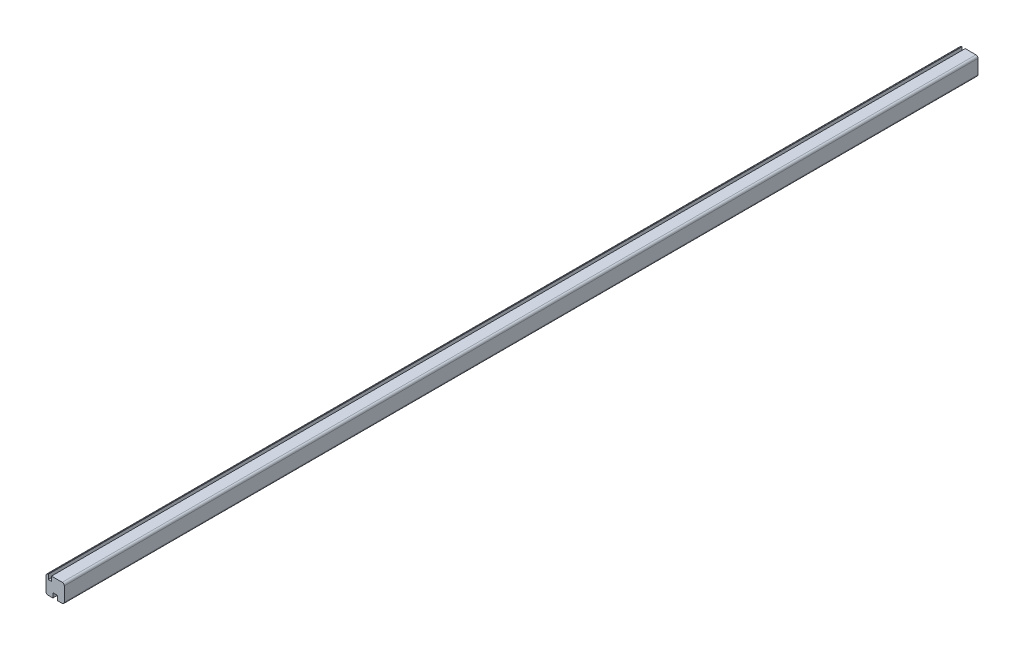
ISO-10303-21;
HEADER;
FILE_DESCRIPTION(('STEP AP214'),'2;1');
FILE_NAME('part.step','',(''),(''),'','','');
FILE_SCHEMA(('AUTOMOTIVE_DESIGN { 1 0 10303 214 1 1 1 1 }'));
ENDSEC;
DATA;
#1=APPLICATION_CONTEXT('core data for automotive mechanical design processes');
#2=APPLICATION_PROTOCOL_DEFINITION('international standard','automotive_design',2000,#1);
#3=PRODUCT_CONTEXT('',#1,'mechanical');
#4=PRODUCT('Part','Part','',(#3));
#5=PRODUCT_RELATED_PRODUCT_CATEGORY('part','',(#4));
#6=PRODUCT_DEFINITION_FORMATION('','',#4);
#7=PRODUCT_DEFINITION_CONTEXT('part definition',#1,'design');
#8=PRODUCT_DEFINITION('design','',#6,#7);
#9=PRODUCT_DEFINITION_SHAPE('','',#8);
#10=(LENGTH_UNIT() NAMED_UNIT(*) SI_UNIT(.MILLI.,.METRE.));
#11=(NAMED_UNIT(*) PLANE_ANGLE_UNIT() SI_UNIT($,.RADIAN.));
#12=(NAMED_UNIT(*) SI_UNIT($,.STERADIAN.) SOLID_ANGLE_UNIT());
#13=UNCERTAINTY_MEASURE_WITH_UNIT(LENGTH_MEASURE(1.E-05),#10,'distance_accuracy_value','');
#14=(GEOMETRIC_REPRESENTATION_CONTEXT(3) GLOBAL_UNCERTAINTY_ASSIGNED_CONTEXT((#13)) GLOBAL_UNIT_ASSIGNED_CONTEXT((#10,
#11,#12)) REPRESENTATION_CONTEXT('',''));
#15=CARTESIAN_POINT('',(0.,0.,0.));
#16=DIRECTION('',(0.,0.,1.));
#17=DIRECTION('',(1.,0.,0.));
#18=AXIS2_PLACEMENT_3D('',#15,#16,#17);
#19=CARTESIAN_POINT('',(-5.,-20.,2000.));
#20=DIRECTION('',(-1.,0.,0.));
#21=DIRECTION('',(0.,-1.,0.));
#22=AXIS2_PLACEMENT_3D('',#19,#20,#21);
#23=PLANE('',#22);
#24=DIRECTION('',(0.,1.,0.));
#25=VECTOR('',#24,1.);
#26=CARTESIAN_POINT('',(-5.,-20.,0.));
#27=LINE('',#26,#25);
#28=CARTESIAN_POINT('',(-5.,-20.,0.));
#29=VERTEX_POINT('',#28);
#30=CARTESIAN_POINT('',(-5.,-10.,0.));
#31=VERTEX_POINT('',#30);
#32=EDGE_CURVE('E178',#29,#31,#27,.T.);
#33=ORIENTED_EDGE('',*,*,#32,.T.);
#34=DIRECTION('',(0.,0.,-1.));
#35=VECTOR('',#34,1.);
#36=CARTESIAN_POINT('',(-5.,-10.,2000.));
#37=LINE('',#36,#35);
#38=CARTESIAN_POINT('',(-5.,-10.,2000.));
#39=VERTEX_POINT('',#38);
#40=EDGE_CURVE('E11',#39,#31,#37,.T.);
#41=ORIENTED_EDGE('',*,*,#40,.F.);
#42=DIRECTION('',(0.,1.,0.));
#43=VECTOR('',#42,1.);
#44=CARTESIAN_POINT('',(-5.,-20.,2000.));
#45=LINE('',#44,#43);
#46=CARTESIAN_POINT('',(-5.,-20.,2000.));
#47=VERTEX_POINT('',#46);
#48=EDGE_CURVE('E208',#47,#39,#45,.T.);
#49=ORIENTED_EDGE('',*,*,#48,.F.);
#50=DIRECTION('',(0.,0.,-1.));
#51=VECTOR('',#50,1.);
#52=CARTESIAN_POINT('',(-5.,-20.,2000.));
#53=LINE('',#52,#51);
#54=EDGE_CURVE('E174',#47,#29,#53,.T.);
#55=ORIENTED_EDGE('',*,*,#54,.T.);
#56=EDGE_LOOP('',(#33,#41,#49,#55));
#57=FACE_BOUND('',#56,.T.);
#58=ADVANCED_FACE('F34',(#57),#23,.F.);
#59=CARTESIAN_POINT('',(-5.,-10.,2000.));
#60=DIRECTION('',(0.,1.,0.));
#61=DIRECTION('',(-1.,0.,0.));
#62=AXIS2_PLACEMENT_3D('',#59,#60,#61);
#63=PLANE('',#62);
#64=DIRECTION('',(1.,0.,0.));
#65=VECTOR('',#64,1.);
#66=CARTESIAN_POINT('',(-5.,-10.,0.));
#67=LINE('',#66,#65);
#68=CARTESIAN_POINT('',(5.,-10.,0.));
#69=VERTEX_POINT('',#68);
#70=EDGE_CURVE('E181',#31,#69,#67,.T.);
#71=ORIENTED_EDGE('',*,*,#70,.T.);
#72=DIRECTION('',(0.,0.,-1.));
#73=VECTOR('',#72,1.);
#74=CARTESIAN_POINT('',(5.,-10.,2000.));
#75=LINE('',#74,#73);
#76=CARTESIAN_POINT('',(5.,-10.,2000.));
#77=VERTEX_POINT('',#76);
#78=EDGE_CURVE('E42',#77,#69,#75,.T.);
#79=ORIENTED_EDGE('',*,*,#78,.F.);
#80=DIRECTION('',(1.,0.,0.));
#81=VECTOR('',#80,1.);
#82=CARTESIAN_POINT('',(-5.,-10.,2000.));
#83=LINE('',#82,#81);
#84=EDGE_CURVE('E117',#39,#77,#83,.T.);
#85=ORIENTED_EDGE('',*,*,#84,.F.);
#86=ORIENTED_EDGE('',*,*,#40,.T.);
#87=EDGE_LOOP('',(#71,#79,#85,#86));
#88=FACE_BOUND('',#87,.T.);
#89=ADVANCED_FACE('F306',(#88),#63,.F.);
#90=CARTESIAN_POINT('',(5.,-20.,2000.));
#91=DIRECTION('',(1.,0.,0.));
#92=DIRECTION('',(0.,0.,-1.));
#93=AXIS2_PLACEMENT_3D('',#90,#91,#92);
#94=PLANE('',#93);
#95=DIRECTION('',(0.,-1.,0.));
#96=VECTOR('',#95,1.);
#97=CARTESIAN_POINT('',(5.,-20.,0.));
#98=LINE('',#97,#96);
#99=CARTESIAN_POINT('',(5.,-20.,0.));
#100=VERTEX_POINT('',#99);
#101=EDGE_CURVE('E183',#69,#100,#98,.T.);
#102=ORIENTED_EDGE('',*,*,#101,.T.);
#103=DIRECTION('',(0.,0.,-1.));
#104=VECTOR('',#103,1.);
#105=CARTESIAN_POINT('',(5.,-20.,2000.));
#106=LINE('',#105,#104);
#107=CARTESIAN_POINT('',(5.,-20.,2000.));
#108=VERTEX_POINT('',#107);
#109=EDGE_CURVE('E239',#108,#100,#106,.T.);
#110=ORIENTED_EDGE('',*,*,#109,.F.);
#111=DIRECTION('',(0.,-1.,0.));
#112=VECTOR('',#111,1.);
#113=CARTESIAN_POINT('',(5.,-20.,2000.));
#114=LINE('',#113,#112);
#115=EDGE_CURVE('E247',#77,#108,#114,.T.);
#116=ORIENTED_EDGE('',*,*,#115,.F.);
#117=ORIENTED_EDGE('',*,*,#78,.T.);
#118=EDGE_LOOP('',(#102,#110,#116,#117));
#119=FACE_BOUND('',#118,.T.);
#120=ADVANCED_FACE('F245',(#119),#94,.F.);
#121=CARTESIAN_POINT('',(5.,-20.,2000.));
#122=DIRECTION('',(0.,1.,0.));
#123=DIRECTION('',(0.,0.,1.));
#124=AXIS2_PLACEMENT_3D('',#121,#122,#123);
#125=PLANE('',#124);
#126=DIRECTION('',(1.,0.,0.));
#127=VECTOR('',#126,1.);
#128=CARTESIAN_POINT('',(5.,-20.,0.));
#129=LINE('',#128,#127);
#130=CARTESIAN_POINT('',(15.5,-20.,0.));
#131=VERTEX_POINT('',#130);
#132=EDGE_CURVE('E185',#100,#131,#129,.T.);
#133=ORIENTED_EDGE('',*,*,#132,.T.);
#134=DIRECTION('',(0.,0.,-1.));
#135=VECTOR('',#134,1.);
#136=CARTESIAN_POINT('',(15.5,-20.,2000.));
#137=LINE('',#136,#135);
#138=CARTESIAN_POINT('',(15.5,-20.,2000.));
#139=VERTEX_POINT('',#138);
#140=EDGE_CURVE('E236',#139,#131,#137,.T.);
#141=ORIENTED_EDGE('',*,*,#140,.F.);
#142=DIRECTION('',(1.,0.,0.));
#143=VECTOR('',#142,1.);
#144=CARTESIAN_POINT('',(5.,-20.,2000.));
#145=LINE('',#144,#143);
#146=EDGE_CURVE('E265',#108,#139,#145,.T.);
#147=ORIENTED_EDGE('',*,*,#146,.F.);
#148=ORIENTED_EDGE('',*,*,#109,.T.);
#149=EDGE_LOOP('',(#133,#141,#147,#148));
#150=FACE_BOUND('',#149,.T.);
#151=ADVANCED_FACE('F256',(#150),#125,.F.);
#152=CARTESIAN_POINT('',(15.5,-15.5,2000.));
#153=DIRECTION('',(0.,0.,-1.));
#154=DIRECTION('',(-1.,0.,0.));
#155=AXIS2_PLACEMENT_3D('',#152,#153,#154);
#156=CYLINDRICAL_SURFACE('',#155,4.5);
#157=CARTESIAN_POINT('',(15.5,-15.5,0.));
#158=DIRECTION('',(0.,0.,1.));
#159=DIRECTION('',(1.,0.,0.));
#160=AXIS2_PLACEMENT_3D('',#157,#158,#159);
#161=CIRCLE('',#160,4.5);
#162=CARTESIAN_POINT('',(20.,-15.5,0.));
#163=VERTEX_POINT('',#162);
#164=EDGE_CURVE('E187',#131,#163,#161,.T.);
#165=ORIENTED_EDGE('',*,*,#164,.T.);
#166=DIRECTION('',(0.,0.,-1.));
#167=VECTOR('',#166,1.);
#168=CARTESIAN_POINT('',(20.,-15.5,2000.));
#169=LINE('',#168,#167);
#170=CARTESIAN_POINT('',(20.,-15.5,2000.));
#171=VERTEX_POINT('',#170);
#172=EDGE_CURVE('E233',#171,#163,#169,.T.);
#173=ORIENTED_EDGE('',*,*,#172,.F.);
#174=CARTESIAN_POINT('',(15.5,-15.5,2000.));
#175=DIRECTION('',(0.,0.,1.));
#176=DIRECTION('',(1.,0.,0.));
#177=AXIS2_PLACEMENT_3D('',#174,#175,#176);
#178=CIRCLE('',#177,4.5);
#179=EDGE_CURVE('E262',#139,#171,#178,.T.);
#180=ORIENTED_EDGE('',*,*,#179,.F.);
#181=ORIENTED_EDGE('',*,*,#140,.T.);
#182=EDGE_LOOP('',(#165,#173,#180,#181));
#183=FACE_BOUND('',#182,.T.);
#184=ADVANCED_FACE('F260',(#183),#156,.T.);
#185=CARTESIAN_POINT('',(20.,-15.5,2000.));
#186=DIRECTION('',(-1.,0.,0.));
#187=DIRECTION('',(0.,0.,1.));
#188=AXIS2_PLACEMENT_3D('',#185,#186,#187);
#189=PLANE('',#188);
#190=DIRECTION('',(0.,1.,0.));
#191=VECTOR('',#190,1.);
#192=CARTESIAN_POINT('',(20.,-15.5,0.));
#193=LINE('',#192,#191);
#194=CARTESIAN_POINT('',(20.,15.5,0.));
#195=VERTEX_POINT('',#194);
#196=EDGE_CURVE('E189',#163,#195,#193,.T.);
#197=ORIENTED_EDGE('',*,*,#196,.T.);
#198=DIRECTION('',(0.,0.,-1.));
#199=VECTOR('',#198,1.);
#200=CARTESIAN_POINT('',(20.,15.5,2000.));
#201=LINE('',#200,#199);
#202=CARTESIAN_POINT('',(20.,15.5,2000.));
#203=VERTEX_POINT('',#202);
#204=EDGE_CURVE('E230',#203,#195,#201,.T.);
#205=ORIENTED_EDGE('',*,*,#204,.F.);
#206=DIRECTION('',(0.,1.,0.));
#207=VECTOR('',#206,1.);
#208=CARTESIAN_POINT('',(20.,-15.5,2000.));
#209=LINE('',#208,#207);
#210=EDGE_CURVE('E264',#171,#203,#209,.T.);
#211=ORIENTED_EDGE('',*,*,#210,.F.);
#212=ORIENTED_EDGE('',*,*,#172,.T.);
#213=EDGE_LOOP('',(#197,#205,#211,#212));
#214=FACE_BOUND('',#213,.T.);
#215=ADVANCED_FACE('F319',(#214),#189,.F.);
#216=CARTESIAN_POINT('',(15.5,15.5,2000.));
#217=DIRECTION('',(0.,0.,-1.));
#218=DIRECTION('',(-1.,0.,0.));
#219=AXIS2_PLACEMENT_3D('',#216,#217,#218);
#220=CYLINDRICAL_SURFACE('',#219,4.5);
#221=CARTESIAN_POINT('',(15.5,15.5,0.));
#222=DIRECTION('',(0.,0.,1.));
#223=DIRECTION('',(-1.,0.,0.));
#224=AXIS2_PLACEMENT_3D('',#221,#222,#223);
#225=CIRCLE('',#224,4.5);
#226=CARTESIAN_POINT('',(15.5,20.,0.));
#227=VERTEX_POINT('',#226);
#228=EDGE_CURVE('E191',#195,#227,#225,.T.);
#229=ORIENTED_EDGE('',*,*,#228,.T.);
#230=DIRECTION('',(0.,0.,-1.));
#231=VECTOR('',#230,1.);
#232=CARTESIAN_POINT('',(15.5,20.,2000.));
#233=LINE('',#232,#231);
#234=CARTESIAN_POINT('',(15.5,20.,2000.));
#235=VERTEX_POINT('',#234);
#236=EDGE_CURVE('E227',#235,#227,#233,.T.);
#237=ORIENTED_EDGE('',*,*,#236,.F.);
#238=CARTESIAN_POINT('',(15.5,15.5,2000.));
#239=DIRECTION('',(0.,0.,1.));
#240=DIRECTION('',(-1.,0.,0.));
#241=AXIS2_PLACEMENT_3D('',#238,#239,#240);
#242=CIRCLE('',#241,4.5);
#243=EDGE_CURVE('E267',#203,#235,#242,.T.);
#244=ORIENTED_EDGE('',*,*,#243,.F.);
#245=ORIENTED_EDGE('',*,*,#204,.T.);
#246=EDGE_LOOP('',(#229,#237,#244,#245));
#247=FACE_BOUND('',#246,.T.);
#248=ADVANCED_FACE('F322',(#247),#220,.T.);
#249=CARTESIAN_POINT('',(-8.,20.,2000.));
#250=DIRECTION('',(0.,-1.,0.));
#251=DIRECTION('',(0.,0.,-1.));
#252=AXIS2_PLACEMENT_3D('',#249,#250,#251);
#253=PLANE('',#252);
#254=DIRECTION('',(-1.,0.,0.));
#255=VECTOR('',#254,1.);
#256=CARTESIAN_POINT('',(-8.,20.,0.));
#257=LINE('',#256,#255);
#258=CARTESIAN_POINT('',(-8.,20.,0.));
#259=VERTEX_POINT('',#258);
#260=EDGE_CURVE('E193',#227,#259,#257,.T.);
#261=ORIENTED_EDGE('',*,*,#260,.T.);
#262=DIRECTION('',(0.,0.,-1.));
#263=VECTOR('',#262,1.);
#264=CARTESIAN_POINT('',(-8.,20.,2000.));
#265=LINE('',#264,#263);
#266=CARTESIAN_POINT('',(-8.,20.,2000.));
#267=VERTEX_POINT('',#266);
#268=EDGE_CURVE('E224',#267,#259,#265,.T.);
#269=ORIENTED_EDGE('',*,*,#268,.F.);
#270=DIRECTION('',(-1.,0.,0.));
#271=VECTOR('',#270,1.);
#272=CARTESIAN_POINT('',(-8.,20.,2000.));
#273=LINE('',#272,#271);
#274=EDGE_CURVE('E273',#235,#267,#273,.T.);
#275=ORIENTED_EDGE('',*,*,#274,.F.);
#276=ORIENTED_EDGE('',*,*,#236,.T.);
#277=EDGE_LOOP('',(#261,#269,#275,#276));
#278=FACE_BOUND('',#277,.T.);
#279=ADVANCED_FACE('F326',(#278),#253,.F.);
#280=CARTESIAN_POINT('',(-8.,20.,2000.));
#281=DIRECTION('',(1.,0.,0.));
#282=DIRECTION('',(0.,1.,0.));
#283=AXIS2_PLACEMENT_3D('',#280,#281,#282);
#284=PLANE('',#283);
#285=DIRECTION('',(0.,-1.,0.));
#286=VECTOR('',#285,1.);
#287=CARTESIAN_POINT('',(-8.,20.,0.));
#288=LINE('',#287,#286);
#289=CARTESIAN_POINT('',(-8.,10.,0.));
#290=VERTEX_POINT('',#289);
#291=EDGE_CURVE('E195',#259,#290,#288,.T.);
#292=ORIENTED_EDGE('',*,*,#291,.T.);
#293=DIRECTION('',(0.,0.,-1.));
#294=VECTOR('',#293,1.);
#295=CARTESIAN_POINT('',(-8.,10.,2000.));
#296=LINE('',#295,#294);
#297=CARTESIAN_POINT('',(-8.,10.,2000.));
#298=VERTEX_POINT('',#297);
#299=EDGE_CURVE('E221',#298,#290,#296,.T.);
#300=ORIENTED_EDGE('',*,*,#299,.F.);
#301=DIRECTION('',(0.,-1.,0.));
#302=VECTOR('',#301,1.);
#303=CARTESIAN_POINT('',(-8.,20.,2000.));
#304=LINE('',#303,#302);
#305=EDGE_CURVE('E275',#267,#298,#304,.T.);
#306=ORIENTED_EDGE('',*,*,#305,.F.);
#307=ORIENTED_EDGE('',*,*,#268,.T.);
#308=EDGE_LOOP('',(#292,#300,#306,#307));
#309=FACE_BOUND('',#308,.T.);
#310=ADVANCED_FACE('F330',(#309),#284,.F.);
#311=CARTESIAN_POINT('',(-15.,10.,2000.));
#312=DIRECTION('',(0.,-1.,0.));
#313=DIRECTION('',(0.,0.,-1.));
#314=AXIS2_PLACEMENT_3D('',#311,#312,#313);
#315=PLANE('',#314);
#316=DIRECTION('',(-1.,0.,0.));
#317=VECTOR('',#316,1.);
#318=CARTESIAN_POINT('',(-15.,10.,0.));
#319=LINE('',#318,#317);
#320=CARTESIAN_POINT('',(-15.,10.,0.));
#321=VERTEX_POINT('',#320);
#322=EDGE_CURVE('E197',#290,#321,#319,.T.);
#323=ORIENTED_EDGE('',*,*,#322,.T.);
#324=DIRECTION('',(0.,0.,-1.));
#325=VECTOR('',#324,1.);
#326=CARTESIAN_POINT('',(-15.,10.,2000.));
#327=LINE('',#326,#325);
#328=CARTESIAN_POINT('',(-15.,10.,2000.));
#329=VERTEX_POINT('',#328);
#330=EDGE_CURVE('E218',#329,#321,#327,.T.);
#331=ORIENTED_EDGE('',*,*,#330,.F.);
#332=DIRECTION('',(-1.,0.,0.));
#333=VECTOR('',#332,1.);
#334=CARTESIAN_POINT('',(-15.,10.,2000.));
#335=LINE('',#334,#333);
#336=EDGE_CURVE('E277',#298,#329,#335,.T.);
#337=ORIENTED_EDGE('',*,*,#336,.F.);
#338=ORIENTED_EDGE('',*,*,#299,.T.);
#339=EDGE_LOOP('',(#323,#331,#337,#338));
#340=FACE_BOUND('',#339,.T.);
#341=ADVANCED_FACE('F334',(#340),#315,.F.);
#342=CARTESIAN_POINT('',(-15.,20.,2000.));
#343=DIRECTION('',(-1.,0.,0.));
#344=DIRECTION('',(0.,-1.,0.));
#345=AXIS2_PLACEMENT_3D('',#342,#343,#344);
#346=PLANE('',#345);
#347=DIRECTION('',(0.,1.,0.));
#348=VECTOR('',#347,1.);
#349=CARTESIAN_POINT('',(-15.,20.,0.));
#350=LINE('',#349,#348);
#351=CARTESIAN_POINT('',(-15.,20.,0.));
#352=VERTEX_POINT('',#351);
#353=EDGE_CURVE('E199',#321,#352,#350,.T.);
#354=ORIENTED_EDGE('',*,*,#353,.T.);
#355=DIRECTION('',(0.,0.,-1.));
#356=VECTOR('',#355,1.);
#357=CARTESIAN_POINT('',(-15.,20.,2000.));
#358=LINE('',#357,#356);
#359=CARTESIAN_POINT('',(-15.,20.,2000.));
#360=VERTEX_POINT('',#359);
#361=EDGE_CURVE('E215',#360,#352,#358,.T.);
#362=ORIENTED_EDGE('',*,*,#361,.F.);
#363=DIRECTION('',(0.,1.,0.));
#364=VECTOR('',#363,1.);
#365=CARTESIAN_POINT('',(-15.,20.,2000.));
#366=LINE('',#365,#364);
#367=EDGE_CURVE('E279',#329,#360,#366,.T.);
#368=ORIENTED_EDGE('',*,*,#367,.F.);
#369=ORIENTED_EDGE('',*,*,#330,.T.);
#370=EDGE_LOOP('',(#354,#362,#368,#369));
#371=FACE_BOUND('',#370,.T.);
#372=ADVANCED_FACE('F338',(#371),#346,.F.);
#373=CARTESIAN_POINT('',(-15.5,20.,2000.));
#374=DIRECTION('',(0.,-1.,0.));
#375=DIRECTION('',(0.,0.,-1.));
#376=AXIS2_PLACEMENT_3D('',#373,#374,#375);
#377=PLANE('',#376);
#378=DIRECTION('',(-1.,0.,0.));
#379=VECTOR('',#378,1.);
#380=CARTESIAN_POINT('',(-15.5,20.,0.));
#381=LINE('',#380,#379);
#382=CARTESIAN_POINT('',(-15.5,20.,0.));
#383=VERTEX_POINT('',#382);
#384=EDGE_CURVE('E201',#352,#383,#381,.T.);
#385=ORIENTED_EDGE('',*,*,#384,.T.);
#386=DIRECTION('',(0.,0.,-1.));
#387=VECTOR('',#386,1.);
#388=CARTESIAN_POINT('',(-15.5,20.,2000.));
#389=LINE('',#388,#387);
#390=CARTESIAN_POINT('',(-15.5,20.,2000.));
#391=VERTEX_POINT('',#390);
#392=EDGE_CURVE('E212',#391,#383,#389,.T.);
#393=ORIENTED_EDGE('',*,*,#392,.F.);
#394=DIRECTION('',(-1.,0.,0.));
#395=VECTOR('',#394,1.);
#396=CARTESIAN_POINT('',(-15.5,20.,2000.));
#397=LINE('',#396,#395);
#398=EDGE_CURVE('E281',#360,#391,#397,.T.);
#399=ORIENTED_EDGE('',*,*,#398,.F.);
#400=ORIENTED_EDGE('',*,*,#361,.T.);
#401=EDGE_LOOP('',(#385,#393,#399,#400));
#402=FACE_BOUND('',#401,.T.);
#403=ADVANCED_FACE('F287',(#402),#377,.F.);
#404=CARTESIAN_POINT('',(-15.5,15.5,2000.));
#405=DIRECTION('',(0.,0.,-1.));
#406=DIRECTION('',(-1.,0.,0.));
#407=AXIS2_PLACEMENT_3D('',#404,#405,#406);
#408=CYLINDRICAL_SURFACE('',#407,4.5);
#409=CARTESIAN_POINT('',(-15.5,15.5,0.));
#410=DIRECTION('',(0.,0.,1.));
#411=DIRECTION('',(-1.,0.,0.));
#412=AXIS2_PLACEMENT_3D('',#409,#410,#411);
#413=CIRCLE('',#412,4.5);
#414=CARTESIAN_POINT('',(-20.,15.5,0.));
#415=VERTEX_POINT('',#414);
#416=EDGE_CURVE('E203',#383,#415,#413,.T.);
#417=ORIENTED_EDGE('',*,*,#416,.T.);
#418=DIRECTION('',(0.,0.,-1.));
#419=VECTOR('',#418,1.);
#420=CARTESIAN_POINT('',(-20.,15.5,2000.));
#421=LINE('',#420,#419);
#422=CARTESIAN_POINT('',(-20.,15.5,2000.));
#423=VERTEX_POINT('',#422);
#424=EDGE_CURVE('E169',#423,#415,#421,.T.);
#425=ORIENTED_EDGE('',*,*,#424,.F.);
#426=CARTESIAN_POINT('',(-15.5,15.5,2000.));
#427=DIRECTION('',(0.,0.,1.));
#428=DIRECTION('',(-1.,0.,0.));
#429=AXIS2_PLACEMENT_3D('',#426,#427,#428);
#430=CIRCLE('',#429,4.5);
#431=EDGE_CURVE('E160',#391,#423,#430,.T.);
#432=ORIENTED_EDGE('',*,*,#431,.F.);
#433=ORIENTED_EDGE('',*,*,#392,.T.);
#434=EDGE_LOOP('',(#417,#425,#432,#433));
#435=FACE_BOUND('',#434,.T.);
#436=ADVANCED_FACE('F291',(#435),#408,.T.);
#437=CARTESIAN_POINT('',(-20.,-15.5,2000.));
#438=DIRECTION('',(1.,0.,0.));
#439=DIRECTION('',(0.,0.,-1.));
#440=AXIS2_PLACEMENT_3D('',#437,#438,#439);
#441=PLANE('',#440);
#442=DIRECTION('',(0.,-1.,0.));
#443=VECTOR('',#442,1.);
#444=CARTESIAN_POINT('',(-20.,-15.5,0.));
#445=LINE('',#444,#443);
#446=CARTESIAN_POINT('',(-20.,-15.5,0.));
#447=VERTEX_POINT('',#446);
#448=EDGE_CURVE('E168',#415,#447,#445,.T.);
#449=ORIENTED_EDGE('',*,*,#448,.T.);
#450=DIRECTION('',(0.,0.,-1.));
#451=VECTOR('',#450,1.);
#452=CARTESIAN_POINT('',(-20.,-15.5,2000.));
#453=LINE('',#452,#451);
#454=CARTESIAN_POINT('',(-20.,-15.5,2000.));
#455=VERTEX_POINT('',#454);
#456=EDGE_CURVE('E165',#455,#447,#453,.T.);
#457=ORIENTED_EDGE('',*,*,#456,.F.);
#458=DIRECTION('',(0.,-1.,0.));
#459=VECTOR('',#458,1.);
#460=CARTESIAN_POINT('',(-20.,-15.5,2000.));
#461=LINE('',#460,#459);
#462=EDGE_CURVE('E154',#423,#455,#461,.T.);
#463=ORIENTED_EDGE('',*,*,#462,.F.);
#464=ORIENTED_EDGE('',*,*,#424,.T.);
#465=EDGE_LOOP('',(#449,#457,#463,#464));
#466=FACE_BOUND('',#465,.T.);
#467=ADVANCED_FACE('F166',(#466),#441,.F.);
#468=CARTESIAN_POINT('',(-15.5,-15.5,2000.));
#469=DIRECTION('',(0.,0.,-1.));
#470=DIRECTION('',(-1.,0.,0.));
#471=AXIS2_PLACEMENT_3D('',#468,#469,#470);
#472=CYLINDRICAL_SURFACE('',#471,4.5);
#473=CARTESIAN_POINT('',(-15.5,-15.5,0.));
#474=DIRECTION('',(0.,0.,1.));
#475=DIRECTION('',(-1.,0.,0.));
#476=AXIS2_PLACEMENT_3D('',#473,#474,#475);
#477=CIRCLE('',#476,4.5);
#478=CARTESIAN_POINT('',(-15.5,-20.,0.));
#479=VERTEX_POINT('',#478);
#480=EDGE_CURVE('E103',#447,#479,#477,.T.);
#481=ORIENTED_EDGE('',*,*,#480,.T.);
#482=DIRECTION('',(0.,0.,-1.));
#483=VECTOR('',#482,1.);
#484=CARTESIAN_POINT('',(-15.5,-20.,2000.));
#485=LINE('',#484,#483);
#486=CARTESIAN_POINT('',(-15.5,-20.,2000.));
#487=VERTEX_POINT('',#486);
#488=EDGE_CURVE('E170',#487,#479,#485,.T.);
#489=ORIENTED_EDGE('',*,*,#488,.F.);
#490=CARTESIAN_POINT('',(-15.5,-15.5,2000.));
#491=DIRECTION('',(0.,0.,1.));
#492=DIRECTION('',(-1.,0.,0.));
#493=AXIS2_PLACEMENT_3D('',#490,#491,#492);
#494=CIRCLE('',#493,4.5);
#495=EDGE_CURVE('E158',#455,#487,#494,.T.);
#496=ORIENTED_EDGE('',*,*,#495,.F.);
#497=ORIENTED_EDGE('',*,*,#456,.T.);
#498=EDGE_LOOP('',(#481,#489,#496,#497));
#499=FACE_BOUND('',#498,.T.);
#500=ADVANCED_FACE('F172',(#499),#472,.T.);
#501=CARTESIAN_POINT('',(-15.5,-20.,2000.));
#502=DIRECTION('',(0.,1.,0.));
#503=DIRECTION('',(0.,0.,1.));
#504=AXIS2_PLACEMENT_3D('',#501,#502,#503);
#505=PLANE('',#504);
#506=DIRECTION('',(1.,0.,0.));
#507=VECTOR('',#506,1.);
#508=CARTESIAN_POINT('',(-15.5,-20.,0.));
#509=LINE('',#508,#507);
#510=EDGE_CURVE('E109',#479,#29,#509,.T.);
#511=ORIENTED_EDGE('',*,*,#510,.T.);
#512=ORIENTED_EDGE('',*,*,#54,.F.);
#513=DIRECTION('',(1.,0.,0.));
#514=VECTOR('',#513,1.);
#515=CARTESIAN_POINT('',(-15.5,-20.,2000.));
#516=LINE('',#515,#514);
#517=EDGE_CURVE('E50',#487,#47,#516,.T.);
#518=ORIENTED_EDGE('',*,*,#517,.F.);
#519=ORIENTED_EDGE('',*,*,#488,.T.);
#520=EDGE_LOOP('',(#511,#512,#518,#519));
#521=FACE_BOUND('',#520,.T.);
#522=ADVANCED_FACE('F295',(#521),#505,.F.);
#523=CARTESIAN_POINT('',(15.5,-15.5,2000.));
#524=DIRECTION('',(0.,0.,1.));
#525=DIRECTION('',(1.,0.,0.));
#526=AXIS2_PLACEMENT_3D('',#523,#524,#525);
#527=PLANE('',#526);
#528=ORIENTED_EDGE('',*,*,#48,.T.);
#529=ORIENTED_EDGE('',*,*,#84,.T.);
#530=ORIENTED_EDGE('',*,*,#115,.T.);
#531=ORIENTED_EDGE('',*,*,#146,.T.);
#532=ORIENTED_EDGE('',*,*,#179,.T.);
#533=ORIENTED_EDGE('',*,*,#210,.T.);
#534=ORIENTED_EDGE('',*,*,#243,.T.);
#535=ORIENTED_EDGE('',*,*,#274,.T.);
#536=ORIENTED_EDGE('',*,*,#305,.T.);
#537=ORIENTED_EDGE('',*,*,#336,.T.);
#538=ORIENTED_EDGE('',*,*,#367,.T.);
#539=ORIENTED_EDGE('',*,*,#398,.T.);
#540=ORIENTED_EDGE('',*,*,#431,.T.);
#541=ORIENTED_EDGE('',*,*,#462,.T.);
#542=ORIENTED_EDGE('',*,*,#495,.T.);
#543=ORIENTED_EDGE('',*,*,#517,.T.);
#544=EDGE_LOOP('',(#528,#529,#530,#531,#532,#533,#534,#535,#536,#537,#538,#539,#540,#541,#542,#543));
#545=FACE_BOUND('',#544,.T.);
#546=ADVANCED_FACE('F156',(#545),#527,.T.);
#547=CARTESIAN_POINT('',(15.5,-15.5,0.));
#548=DIRECTION('',(0.,0.,1.));
#549=DIRECTION('',(1.,0.,0.));
#550=AXIS2_PLACEMENT_3D('',#547,#548,#549);
#551=PLANE('',#550);
#552=ORIENTED_EDGE('',*,*,#32,.F.);
#553=ORIENTED_EDGE('',*,*,#510,.F.);
#554=ORIENTED_EDGE('',*,*,#480,.F.);
#555=ORIENTED_EDGE('',*,*,#448,.F.);
#556=ORIENTED_EDGE('',*,*,#416,.F.);
#557=ORIENTED_EDGE('',*,*,#384,.F.);
#558=ORIENTED_EDGE('',*,*,#353,.F.);
#559=ORIENTED_EDGE('',*,*,#322,.F.);
#560=ORIENTED_EDGE('',*,*,#291,.F.);
#561=ORIENTED_EDGE('',*,*,#260,.F.);
#562=ORIENTED_EDGE('',*,*,#228,.F.);
#563=ORIENTED_EDGE('',*,*,#196,.F.);
#564=ORIENTED_EDGE('',*,*,#164,.F.);
#565=ORIENTED_EDGE('',*,*,#132,.F.);
#566=ORIENTED_EDGE('',*,*,#101,.F.);
#567=ORIENTED_EDGE('',*,*,#70,.F.);
#568=EDGE_LOOP('',(#552,#553,#554,#555,#556,#557,#558,#559,#560,#561,#562,#563,#564,#565,#566,#567));
#569=FACE_BOUND('',#568,.T.);
#570=ADVANCED_FACE('F251',(#569),#551,.F.);
#571=CLOSED_SHELL('',(#58,#89,#120,#151,#184,#215,#248,#279,#310,#341,#372,#403,#436,#467,#500,
#522,#546,#570));
#572=MANIFOLD_SOLID_BREP('B2',#571);
#573=ADVANCED_BREP_SHAPE_REPRESENTATION('',(#18,#572),#14);
#574=SHAPE_DEFINITION_REPRESENTATION(#9,#573);
ENDSEC;
END-ISO-10303-21;
